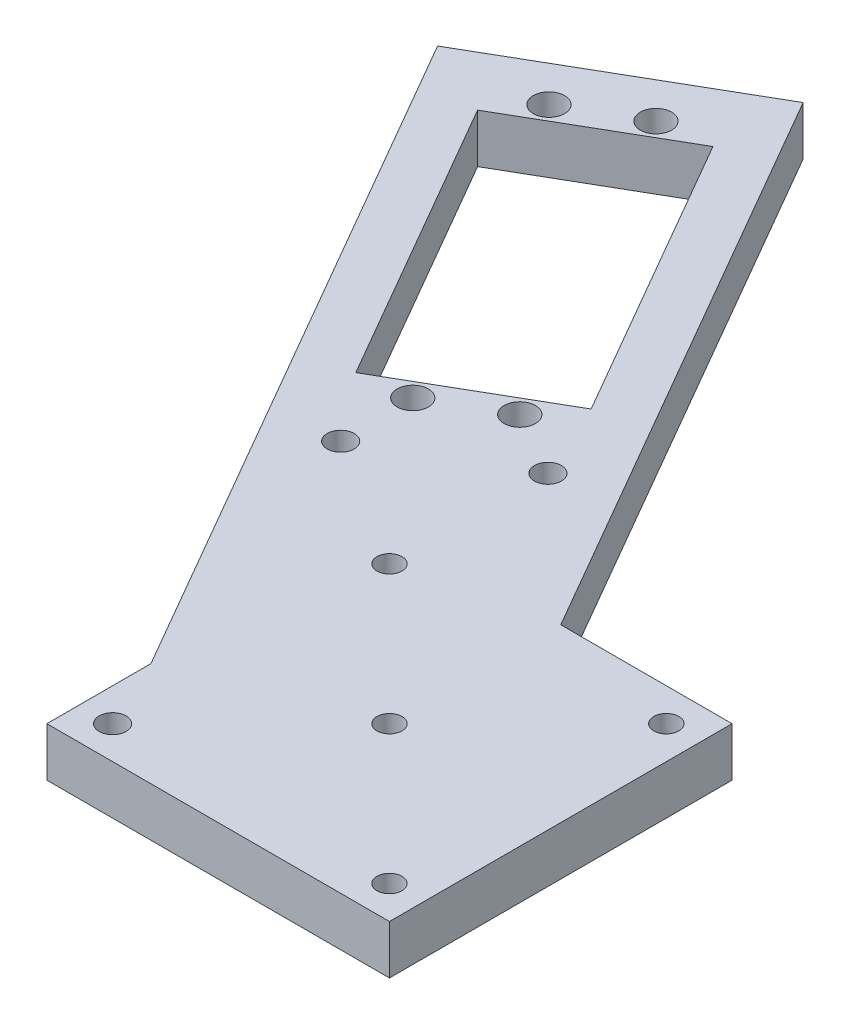
ISO-10303-21;
HEADER;
FILE_DESCRIPTION(('STEP AP214'),'2;1');
FILE_NAME('part.step','',(''),(''),'','','');
FILE_SCHEMA(('AUTOMOTIVE_DESIGN { 1 0 10303 214 1 1 1 1 }'));
ENDSEC;
DATA;
#1=APPLICATION_CONTEXT('core data for automotive mechanical design processes');
#2=APPLICATION_PROTOCOL_DEFINITION('international standard','automotive_design',2000,#1);
#3=PRODUCT_CONTEXT('',#1,'mechanical');
#4=PRODUCT('Part','Part','',(#3));
#5=PRODUCT_RELATED_PRODUCT_CATEGORY('part','',(#4));
#6=PRODUCT_DEFINITION_FORMATION('','',#4);
#7=PRODUCT_DEFINITION_CONTEXT('part definition',#1,'design');
#8=PRODUCT_DEFINITION('design','',#6,#7);
#9=PRODUCT_DEFINITION_SHAPE('','',#8);
#10=(LENGTH_UNIT() NAMED_UNIT(*) SI_UNIT(.MILLI.,.METRE.));
#11=(NAMED_UNIT(*) PLANE_ANGLE_UNIT() SI_UNIT($,.RADIAN.));
#12=(NAMED_UNIT(*) SI_UNIT($,.STERADIAN.) SOLID_ANGLE_UNIT());
#13=UNCERTAINTY_MEASURE_WITH_UNIT(LENGTH_MEASURE(1.E-05),#10,'distance_accuracy_value','');
#14=(GEOMETRIC_REPRESENTATION_CONTEXT(3) GLOBAL_UNCERTAINTY_ASSIGNED_CONTEXT((#13)) GLOBAL_UNIT_ASSIGNED_CONTEXT((#10,
#11,#12)) REPRESENTATION_CONTEXT('',''));
#15=CARTESIAN_POINT('',(0.,0.,0.));
#16=DIRECTION('',(0.,0.,1.));
#17=DIRECTION('',(1.,0.,0.));
#18=AXIS2_PLACEMENT_3D('',#15,#16,#17);
#19=CARTESIAN_POINT('',(0.,6.35,0.));
#20=DIRECTION('',(0.,1.,0.));
#21=DIRECTION('',(0.,0.,1.));
#22=AXIS2_PLACEMENT_3D('',#19,#20,#21);
#23=PLANE('',#22);
#24=CARTESIAN_POINT('',(-59.0837015967498,6.35,-80.0392716410195));
#25=DIRECTION('',(0.,-1.,0.));
#26=DIRECTION('',(0.,0.,-1.));
#27=AXIS2_PLACEMENT_3D('',#24,#25,#26);
#28=CIRCLE('',#27,2.032);
#29=CARTESIAN_POINT('',(-59.0837015967498,6.35,-82.0712716410195));
#30=VERTEX_POINT('',#29);
#31=EDGE_CURVE('E226',#30,#30,#28,.T.);
#32=ORIENTED_EDGE('',*,*,#31,.T.);
#33=EDGE_LOOP('',(#32));
#34=FACE_BOUND('',#33,.T.);
#35=CARTESIAN_POINT('',(-26.1548834943,6.35,-43.3248856543825));
#36=DIRECTION('',(0.,-1.,0.));
#37=DIRECTION('',(0.,0.,-1.));
#38=AXIS2_PLACEMENT_3D('',#35,#36,#37);
#39=CIRCLE('',#38,2.03200000000001);
#40=CARTESIAN_POINT('',(-26.1548834943,6.35,-45.3568856543825));
#41=VERTEX_POINT('',#40);
#42=EDGE_CURVE('E233',#41,#41,#39,.T.);
#43=ORIENTED_EDGE('',*,*,#42,.T.);
#44=EDGE_LOOP('',(#43));
#45=FACE_BOUND('',#44,.T.);
#46=CARTESIAN_POINT('',(-34.9537015967498,6.35,-38.2448856543825));
#47=DIRECTION('',(0.,-1.,0.));
#48=DIRECTION('',(0.,0.,-1.));
#49=AXIS2_PLACEMENT_3D('',#46,#47,#48);
#50=CIRCLE('',#49,2.03200000000001);
#51=CARTESIAN_POINT('',(-34.9537015967498,6.35,-40.2768856543825));
#52=VERTEX_POINT('',#51);
#53=EDGE_CURVE('E220',#52,#52,#50,.T.);
#54=ORIENTED_EDGE('',*,*,#53,.T.);
#55=EDGE_LOOP('',(#54));
#56=FACE_BOUND('',#55,.T.);
#57=CARTESIAN_POINT('',(-50.2848834942999,6.35,-85.1192716410195));
#58=DIRECTION('',(0.,-1.,0.));
#59=DIRECTION('',(0.,0.,-1.));
#60=AXIS2_PLACEMENT_3D('',#57,#58,#59);
#61=CIRCLE('',#60,2.032);
#62=CARTESIAN_POINT('',(-50.2848834942999,6.35,-87.1512716410195));
#63=VERTEX_POINT('',#62);
#64=EDGE_CURVE('E238',#63,#63,#61,.T.);
#65=ORIENTED_EDGE('',*,*,#64,.T.);
#66=EDGE_LOOP('',(#65));
#67=FACE_BOUND('',#66,.T.);
#68=DIRECTION('',(0.500000000000001,0.,0.866025403784438));
#69=VECTOR('',#68,1.);
#70=CARTESIAN_POINT('',(-20.2897420101024,6.35,11.7142880113207));
#71=LINE('',#70,#69);
#72=CARTESIAN_POINT('',(-72.8936886800531,6.35,-79.3984202996773));
#73=VERTEX_POINT('',#72);
#74=CARTESIAN_POINT('',(-22.093688680053,6.35,8.58976072482156));
#75=VERTEX_POINT('',#74);
#76=EDGE_CURVE('E244',#73,#75,#71,.T.);
#77=ORIENTED_EDGE('',*,*,#76,.T.);
#78=DIRECTION('',(0.,0.,1.));
#79=VECTOR('',#78,1.);
#80=CARTESIAN_POINT('',(-22.093688680053,6.35,0.));
#81=LINE('',#80,#79);
#82=CARTESIAN_POINT('',(-22.093688680053,6.35,22.0936886800531));
#83=VERTEX_POINT('',#82);
#84=EDGE_CURVE('E247',#75,#83,#81,.T.);
#85=ORIENTED_EDGE('',*,*,#84,.T.);
#86=DIRECTION('',(1.,0.,0.));
#87=VECTOR('',#86,1.);
#88=CARTESIAN_POINT('',(0.,6.35,22.0936886800531));
#89=LINE('',#88,#87);
#90=CARTESIAN_POINT('',(22.356311319947,6.35,22.0936886800531));
#91=VERTEX_POINT('',#90);
#92=EDGE_CURVE('E250',#83,#91,#89,.T.);
#93=ORIENTED_EDGE('',*,*,#92,.T.);
#94=DIRECTION('',(0.,0.,-1.));
#95=VECTOR('',#94,1.);
#96=CARTESIAN_POINT('',(22.356311319947,6.35,0.));
#97=LINE('',#96,#95);
#98=CARTESIAN_POINT('',(22.356311319947,6.35,-22.3563113199469));
#99=VERTEX_POINT('',#98);
#100=EDGE_CURVE('E252',#91,#99,#97,.T.);
#101=ORIENTED_EDGE('',*,*,#100,.T.);
#102=DIRECTION('',(-1.,0.,0.));
#103=VECTOR('',#102,1.);
#104=CARTESIAN_POINT('',(0.,6.35,-22.3563113199469));
#105=LINE('',#104,#103);
#106=CARTESIAN_POINT('',(0.131311319947031,6.35,-22.3563113199469));
#107=VERTEX_POINT('',#106);
#108=EDGE_CURVE('E254',#99,#107,#105,.T.);
#109=ORIENTED_EDGE('',*,*,#108,.T.);
#110=DIRECTION('',(0.500000000000001,0.,0.866025403784438));
#111=VECTOR('',#110,1.);
#112=CARTESIAN_POINT('',(9.77905025895412,6.35,-5.64593729942606));
#113=LINE('',#112,#111);
#114=CARTESIAN_POINT('',(-42.8248964109966,6.35,-96.758645610424));
#115=VERTEX_POINT('',#114);
#116=EDGE_CURVE('E256',#115,#107,#113,.T.);
#117=ORIENTED_EDGE('',*,*,#116,.F.);
#118=DIRECTION('',(-0.86602540378444,0.,0.499999999999998));
#119=VECTOR('',#118,1.);
#120=CARTESIAN_POINT('',(-52.6039466699504,6.35,-91.1127083109981));
#121=LINE('',#120,#119);
#122=EDGE_CURVE('E259',#115,#73,#121,.T.);
#123=ORIENTED_EDGE('',*,*,#122,.T.);
#124=EDGE_LOOP('',(#77,#85,#93,#101,#109,#117,#123));
#125=FACE_BOUND('',#124,.T.);
#126=CARTESIAN_POINT('',(-17.7237626625019,6.35,-38.5444330043896));
#127=DIRECTION('',(0.,1.,0.));
#128=DIRECTION('',(0.,0.,1.));
#129=AXIS2_PLACEMENT_3D('',#126,#127,#128);
#130=CIRCLE('',#129,1.74995000000001);
#131=CARTESIAN_POINT('',(-17.7237626625019,6.35,-36.7944830043896));
#132=VERTEX_POINT('',#131);
#133=EDGE_CURVE('E261',#132,#132,#130,.T.);
#134=ORIENTED_EDGE('',*,*,#133,.F.);
#135=EDGE_LOOP('',(#134));
#136=FACE_BOUND('',#135,.T.);
#137=CARTESIAN_POINT('',(-34.768288680053,6.35,-28.7037713199469));
#138=DIRECTION('',(0.,1.,0.));
#139=DIRECTION('',(0.,0.,1.));
#140=AXIS2_PLACEMENT_3D('',#137,#138,#139);
#141=CIRCLE('',#140,1.74995);
#142=CARTESIAN_POINT('',(-34.768288680053,6.35,-26.9538213199469));
#143=VERTEX_POINT('',#142);
#144=EDGE_CURVE('E264',#143,#143,#141,.T.);
#145=ORIENTED_EDGE('',*,*,#144,.F.);
#146=EDGE_LOOP('',(#145));
#147=FACE_BOUND('',#146,.T.);
#148=CARTESIAN_POINT('',(18.0918235620853,6.35,-18.0918235620852));
#149=DIRECTION('',(0.,1.,0.));
#150=DIRECTION('',(0.,0.,1.));
#151=AXIS2_PLACEMENT_3D('',#148,#149,#150);
#152=CIRCLE('',#151,1.62499999999988);
#153=CARTESIAN_POINT('',(18.0918235620853,6.35,-16.4668235620853));
#154=VERTEX_POINT('',#153);
#155=EDGE_CURVE('E267',#154,#154,#152,.T.);
#156=ORIENTED_EDGE('',*,*,#155,.F.);
#157=EDGE_LOOP('',(#156));
#158=FACE_BOUND('',#157,.T.);
#159=CARTESIAN_POINT('',(-17.8292009221912,6.35,17.8292009221914));
#160=DIRECTION('',(0.,1.,0.));
#161=DIRECTION('',(0.,0.,1.));
#162=AXIS2_PLACEMENT_3D('',#159,#160,#161);
#163=CIRCLE('',#162,1.75);
#164=CARTESIAN_POINT('',(-17.8292009221912,6.35,19.5792009221914));
#165=VERTEX_POINT('',#164);
#166=EDGE_CURVE('E270',#165,#165,#163,.T.);
#167=ORIENTED_EDGE('',*,*,#166,.F.);
#168=EDGE_LOOP('',(#167));
#169=FACE_BOUND('',#168,.T.);
#170=CARTESIAN_POINT('',(18.0918235620853,6.35,17.8292009221915));
#171=DIRECTION('',(0.,1.,0.));
#172=DIRECTION('',(0.,0.,1.));
#173=AXIS2_PLACEMENT_3D('',#170,#171,#172);
#174=CIRCLE('',#173,1.62500000000009);
#175=CARTESIAN_POINT('',(18.0918235620853,6.35,19.4542009221916));
#176=VERTEX_POINT('',#175);
#177=EDGE_CURVE('E273',#176,#176,#174,.T.);
#178=ORIENTED_EDGE('',*,*,#177,.F.);
#179=EDGE_LOOP('',(#178));
#180=FACE_BOUND('',#179,.T.);
#181=CARTESIAN_POINT('',(0.131311319947036,6.35,-0.131311319946925));
#182=DIRECTION('',(0.,1.,0.));
#183=DIRECTION('',(0.,0.,1.));
#184=AXIS2_PLACEMENT_3D('',#181,#182,#183);
#185=CIRCLE('',#184,1.62500000000009);
#186=CARTESIAN_POINT('',(0.131311319947036,6.35,1.49368868005317));
#187=VERTEX_POINT('',#186);
#188=EDGE_CURVE('E276',#187,#187,#185,.T.);
#189=ORIENTED_EDGE('',*,*,#188,.F.);
#190=EDGE_LOOP('',(#189));
#191=FACE_BOUND('',#190,.T.);
#192=CARTESIAN_POINT('',(-17.8292009221912,6.35,-18.0918235620852));
#193=DIRECTION('',(0.,1.,0.));
#194=DIRECTION('',(0.,0.,1.));
#195=AXIS2_PLACEMENT_3D('',#192,#193,#194);
#196=CIRCLE('',#195,1.62500000000009);
#197=CARTESIAN_POINT('',(-17.8292009221912,6.35,-16.4668235620851));
#198=VERTEX_POINT('',#197);
#199=EDGE_CURVE('E279',#198,#198,#196,.T.);
#200=ORIENTED_EDGE('',*,*,#199,.F.);
#201=EDGE_LOOP('',(#200));
#202=FACE_BOUND('',#201,.T.);
#203=DIRECTION('',(0.866025403784439,0.,-0.5));
#204=VECTOR('',#203,1.);
#205=CARTESIAN_POINT('',(-48.1589466699505,6.35,-83.4137424713545));
#206=LINE('',#205,#204);
#207=CARTESIAN_POINT('',(-63.0929924582198,6.35,-74.791567115407));
#208=VERTEX_POINT('',#207);
#209=CARTESIAN_POINT('',(-43.73559263283,6.35,-85.967567115407));
#210=VERTEX_POINT('',#209);
#211=EDGE_CURVE('E197',#208,#210,#206,.T.);
#212=ORIENTED_EDGE('',*,*,#211,.T.);
#213=DIRECTION('',(-0.5,0.,-0.866025403784439));
#214=VECTOR('',#213,1.);
#215=CARTESIAN_POINT('',(4.42335403712058,6.35,-2.55382464405258));
#216=LINE('',#215,#214);
#217=CARTESIAN_POINT('',(-22.14559263283,6.35,-48.572590179995));
#218=VERTEX_POINT('',#217);
#219=EDGE_CURVE('E193',#218,#210,#216,.T.);
#220=ORIENTED_EDGE('',*,*,#219,.F.);
#221=DIRECTION('',(0.866025403784439,0.,-0.5));
#222=VECTOR('',#221,1.);
#223=CARTESIAN_POINT('',(-26.5689466699506,6.35,-46.0187655359424));
#224=LINE('',#223,#222);
#225=CARTESIAN_POINT('',(-41.5029924582198,6.35,-37.396590179995));
#226=VERTEX_POINT('',#225);
#227=EDGE_CURVE('E185',#226,#218,#224,.T.);
#228=ORIENTED_EDGE('',*,*,#227,.F.);
#229=DIRECTION('',(-0.5,0.,-0.866025403784439));
#230=VECTOR('',#229,1.);
#231=CARTESIAN_POINT('',(-14.9340457882692,6.35,8.62217535594742));
#232=LINE('',#231,#230);
#233=EDGE_CURVE('E117',#226,#208,#232,.T.);
#234=ORIENTED_EDGE('',*,*,#233,.T.);
#235=EDGE_LOOP('',(#212,#220,#228,#234));
#236=FACE_BOUND('',#235,.T.);
#237=ADVANCED_FACE('F102',(#34,#45,#56,#67,#125,#136,#147,#158,#169,#180,#191,#202,#236),#23,.T.);
#238=CARTESIAN_POINT('',(0.,0.,0.));
#239=DIRECTION('',(0.,1.,0.));
#240=DIRECTION('',(0.,0.,1.));
#241=AXIS2_PLACEMENT_3D('',#238,#239,#240);
#242=PLANE('',#241);
#243=CARTESIAN_POINT('',(-59.0837015967498,0.,-80.0392716410195));
#244=DIRECTION('',(0.,-1.,0.));
#245=DIRECTION('',(0.,0.,-1.));
#246=AXIS2_PLACEMENT_3D('',#243,#244,#245);
#247=CIRCLE('',#246,2.032);
#248=CARTESIAN_POINT('',(-59.0837015967498,0.,-82.0712716410195));
#249=VERTEX_POINT('',#248);
#250=EDGE_CURVE('E230',#249,#249,#247,.T.);
#251=ORIENTED_EDGE('',*,*,#250,.F.);
#252=EDGE_LOOP('',(#251));
#253=FACE_BOUND('',#252,.T.);
#254=CARTESIAN_POINT('',(-26.1548834943,0.,-43.3248856543825));
#255=DIRECTION('',(0.,-1.,0.));
#256=DIRECTION('',(0.,0.,-1.));
#257=AXIS2_PLACEMENT_3D('',#254,#255,#256);
#258=CIRCLE('',#257,2.03200000000001);
#259=CARTESIAN_POINT('',(-26.1548834943,0.,-45.3568856543825));
#260=VERTEX_POINT('',#259);
#261=EDGE_CURVE('E223',#260,#260,#258,.T.);
#262=ORIENTED_EDGE('',*,*,#261,.F.);
#263=EDGE_LOOP('',(#262));
#264=FACE_BOUND('',#263,.T.);
#265=CARTESIAN_POINT('',(-17.8292009221912,0.,-18.0918235620852));
#266=DIRECTION('',(0.,1.,0.));
#267=DIRECTION('',(0.,0.,1.));
#268=AXIS2_PLACEMENT_3D('',#265,#266,#267);
#269=CIRCLE('',#268,1.62500000000009);
#270=CARTESIAN_POINT('',(-17.8292009221912,0.,-16.4668235620851));
#271=VERTEX_POINT('',#270);
#272=EDGE_CURVE('E248',#271,#271,#269,.T.);
#273=ORIENTED_EDGE('',*,*,#272,.T.);
#274=EDGE_LOOP('',(#273));
#275=FACE_BOUND('',#274,.T.);
#276=CARTESIAN_POINT('',(0.131311319947036,0.,-0.131311319946925));
#277=DIRECTION('',(0.,1.,0.));
#278=DIRECTION('',(0.,0.,1.));
#279=AXIS2_PLACEMENT_3D('',#276,#277,#278);
#280=CIRCLE('',#279,1.62500000000009);
#281=CARTESIAN_POINT('',(0.131311319947036,0.,1.49368868005317));
#282=VERTEX_POINT('',#281);
#283=EDGE_CURVE('E314',#282,#282,#280,.T.);
#284=ORIENTED_EDGE('',*,*,#283,.T.);
#285=EDGE_LOOP('',(#284));
#286=FACE_BOUND('',#285,.T.);
#287=CARTESIAN_POINT('',(18.0918235620853,0.,17.8292009221915));
#288=DIRECTION('',(0.,1.,0.));
#289=DIRECTION('',(0.,0.,1.));
#290=AXIS2_PLACEMENT_3D('',#287,#288,#289);
#291=CIRCLE('',#290,1.62500000000009);
#292=CARTESIAN_POINT('',(18.0918235620853,0.,19.4542009221916));
#293=VERTEX_POINT('',#292);
#294=EDGE_CURVE('E311',#293,#293,#291,.T.);
#295=ORIENTED_EDGE('',*,*,#294,.T.);
#296=EDGE_LOOP('',(#295));
#297=FACE_BOUND('',#296,.T.);
#298=CARTESIAN_POINT('',(-17.8292009221912,0.,17.8292009221914));
#299=DIRECTION('',(0.,1.,0.));
#300=DIRECTION('',(0.,0.,1.));
#301=AXIS2_PLACEMENT_3D('',#298,#299,#300);
#302=CIRCLE('',#301,1.75);
#303=CARTESIAN_POINT('',(-17.8292009221912,0.,19.5792009221914));
#304=VERTEX_POINT('',#303);
#305=EDGE_CURVE('E308',#304,#304,#302,.T.);
#306=ORIENTED_EDGE('',*,*,#305,.T.);
#307=EDGE_LOOP('',(#306));
#308=FACE_BOUND('',#307,.T.);
#309=CARTESIAN_POINT('',(18.0918235620853,0.,-18.0918235620852));
#310=DIRECTION('',(0.,1.,0.));
#311=DIRECTION('',(0.,0.,1.));
#312=AXIS2_PLACEMENT_3D('',#309,#310,#311);
#313=CIRCLE('',#312,1.62499999999988);
#314=CARTESIAN_POINT('',(18.0918235620853,0.,-16.4668235620853));
#315=VERTEX_POINT('',#314);
#316=EDGE_CURVE('E305',#315,#315,#313,.T.);
#317=ORIENTED_EDGE('',*,*,#316,.T.);
#318=EDGE_LOOP('',(#317));
#319=FACE_BOUND('',#318,.T.);
#320=CARTESIAN_POINT('',(-34.768288680053,0.,-28.7037713199469));
#321=DIRECTION('',(0.,1.,0.));
#322=DIRECTION('',(0.,0.,1.));
#323=AXIS2_PLACEMENT_3D('',#320,#321,#322);
#324=CIRCLE('',#323,1.74995);
#325=CARTESIAN_POINT('',(-34.768288680053,0.,-26.9538213199469));
#326=VERTEX_POINT('',#325);
#327=EDGE_CURVE('E302',#326,#326,#324,.T.);
#328=ORIENTED_EDGE('',*,*,#327,.T.);
#329=EDGE_LOOP('',(#328));
#330=FACE_BOUND('',#329,.T.);
#331=CARTESIAN_POINT('',(-17.7237626625019,0.,-38.5444330043896));
#332=DIRECTION('',(0.,1.,0.));
#333=DIRECTION('',(0.,0.,1.));
#334=AXIS2_PLACEMENT_3D('',#331,#332,#333);
#335=CIRCLE('',#334,1.74995000000001);
#336=CARTESIAN_POINT('',(-17.7237626625019,0.,-36.7944830043896));
#337=VERTEX_POINT('',#336);
#338=EDGE_CURVE('E299',#337,#337,#335,.T.);
#339=ORIENTED_EDGE('',*,*,#338,.T.);
#340=EDGE_LOOP('',(#339));
#341=FACE_BOUND('',#340,.T.);
#342=DIRECTION('',(0.500000000000001,0.,0.866025403784438));
#343=VECTOR('',#342,1.);
#344=CARTESIAN_POINT('',(-20.2897420101024,0.,11.7142880113207));
#345=LINE('',#344,#343);
#346=CARTESIAN_POINT('',(-72.8936886800531,0.,-79.3984202996773));
#347=VERTEX_POINT('',#346);
#348=CARTESIAN_POINT('',(-22.093688680053,0.,8.58976072482156));
#349=VERTEX_POINT('',#348);
#350=EDGE_CURVE('E241',#347,#349,#345,.T.);
#351=ORIENTED_EDGE('',*,*,#350,.F.);
#352=DIRECTION('',(-0.86602540378444,0.,0.499999999999998));
#353=VECTOR('',#352,1.);
#354=CARTESIAN_POINT('',(-52.6039466699504,0.,-91.1127083109981));
#355=LINE('',#354,#353);
#356=CARTESIAN_POINT('',(-42.8248964109966,0.,-96.758645610424));
#357=VERTEX_POINT('',#356);
#358=EDGE_CURVE('E297',#357,#347,#355,.T.);
#359=ORIENTED_EDGE('',*,*,#358,.F.);
#360=DIRECTION('',(0.500000000000001,0.,0.866025403784438));
#361=VECTOR('',#360,1.);
#362=CARTESIAN_POINT('',(9.77905025895412,0.,-5.64593729942606));
#363=LINE('',#362,#361);
#364=CARTESIAN_POINT('',(0.131311319947031,0.,-22.3563113199469));
#365=VERTEX_POINT('',#364);
#366=EDGE_CURVE('E294',#357,#365,#363,.T.);
#367=ORIENTED_EDGE('',*,*,#366,.T.);
#368=DIRECTION('',(-1.,0.,0.));
#369=VECTOR('',#368,1.);
#370=CARTESIAN_POINT('',(0.,0.,-22.3563113199469));
#371=LINE('',#370,#369);
#372=CARTESIAN_POINT('',(22.356311319947,0.,-22.3563113199469));
#373=VERTEX_POINT('',#372);
#374=EDGE_CURVE('E291',#373,#365,#371,.T.);
#375=ORIENTED_EDGE('',*,*,#374,.F.);
#376=DIRECTION('',(0.,0.,-1.));
#377=VECTOR('',#376,1.);
#378=CARTESIAN_POINT('',(22.356311319947,0.,0.));
#379=LINE('',#378,#377);
#380=CARTESIAN_POINT('',(22.356311319947,0.,22.0936886800531));
#381=VERTEX_POINT('',#380);
#382=EDGE_CURVE('E289',#381,#373,#379,.T.);
#383=ORIENTED_EDGE('',*,*,#382,.F.);
#384=DIRECTION('',(1.,0.,0.));
#385=VECTOR('',#384,1.);
#386=CARTESIAN_POINT('',(0.,0.,22.0936886800531));
#387=LINE('',#386,#385);
#388=CARTESIAN_POINT('',(-22.093688680053,0.,22.0936886800531));
#389=VERTEX_POINT('',#388);
#390=EDGE_CURVE('E287',#389,#381,#387,.T.);
#391=ORIENTED_EDGE('',*,*,#390,.F.);
#392=DIRECTION('',(0.,0.,1.));
#393=VECTOR('',#392,1.);
#394=CARTESIAN_POINT('',(-22.093688680053,0.,0.));
#395=LINE('',#394,#393);
#396=EDGE_CURVE('E285',#349,#389,#395,.T.);
#397=ORIENTED_EDGE('',*,*,#396,.F.);
#398=EDGE_LOOP('',(#351,#359,#367,#375,#383,#391,#397));
#399=FACE_BOUND('',#398,.T.);
#400=CARTESIAN_POINT('',(-50.2848834942999,0.,-85.1192716410195));
#401=DIRECTION('',(0.,-1.,0.));
#402=DIRECTION('',(0.,0.,-1.));
#403=AXIS2_PLACEMENT_3D('',#400,#401,#402);
#404=CIRCLE('',#403,2.032);
#405=CARTESIAN_POINT('',(-50.2848834942999,0.,-87.1512716410195));
#406=VERTEX_POINT('',#405);
#407=EDGE_CURVE('E229',#406,#406,#404,.T.);
#408=ORIENTED_EDGE('',*,*,#407,.F.);
#409=EDGE_LOOP('',(#408));
#410=FACE_BOUND('',#409,.T.);
#411=CARTESIAN_POINT('',(-34.9537015967498,0.,-38.2448856543825));
#412=DIRECTION('',(0.,-1.,0.));
#413=DIRECTION('',(0.,0.,-1.));
#414=AXIS2_PLACEMENT_3D('',#411,#412,#413);
#415=CIRCLE('',#414,2.03200000000001);
#416=CARTESIAN_POINT('',(-34.9537015967498,0.,-40.2768856543825));
#417=VERTEX_POINT('',#416);
#418=EDGE_CURVE('E216',#417,#417,#415,.T.);
#419=ORIENTED_EDGE('',*,*,#418,.F.);
#420=EDGE_LOOP('',(#419));
#421=FACE_BOUND('',#420,.T.);
#422=DIRECTION('',(-0.5,0.,-0.866025403784439));
#423=VECTOR('',#422,1.);
#424=CARTESIAN_POINT('',(4.42335403712058,0.,-2.55382464405258));
#425=LINE('',#424,#423);
#426=CARTESIAN_POINT('',(-22.14559263283,0.,-48.572590179995));
#427=VERTEX_POINT('',#426);
#428=CARTESIAN_POINT('',(-43.73559263283,0.,-85.967567115407));
#429=VERTEX_POINT('',#428);
#430=EDGE_CURVE('E125',#427,#429,#425,.T.);
#431=ORIENTED_EDGE('',*,*,#430,.T.);
#432=DIRECTION('',(0.866025403784439,0.,-0.5));
#433=VECTOR('',#432,1.);
#434=CARTESIAN_POINT('',(-48.1589466699505,0.,-83.4137424713545));
#435=LINE('',#434,#433);
#436=CARTESIAN_POINT('',(-63.0929924582198,0.,-74.791567115407));
#437=VERTEX_POINT('',#436);
#438=EDGE_CURVE('E201',#437,#429,#435,.T.);
#439=ORIENTED_EDGE('',*,*,#438,.F.);
#440=DIRECTION('',(-0.5,0.,-0.866025403784439));
#441=VECTOR('',#440,1.);
#442=CARTESIAN_POINT('',(-14.9340457882692,0.,8.62217535594742));
#443=LINE('',#442,#441);
#444=CARTESIAN_POINT('',(-41.5029924582198,0.,-37.396590179995));
#445=VERTEX_POINT('',#444);
#446=EDGE_CURVE('E204',#445,#437,#443,.T.);
#447=ORIENTED_EDGE('',*,*,#446,.F.);
#448=DIRECTION('',(0.866025403784439,0.,-0.5));
#449=VECTOR('',#448,1.);
#450=CARTESIAN_POINT('',(-26.5689466699506,0.,-46.0187655359424));
#451=LINE('',#450,#449);
#452=EDGE_CURVE('E210',#445,#427,#451,.T.);
#453=ORIENTED_EDGE('',*,*,#452,.T.);
#454=EDGE_LOOP('',(#431,#439,#447,#453));
#455=FACE_BOUND('',#454,.T.);
#456=ADVANCED_FACE('F341',(#253,#264,#275,#286,#297,#308,#319,#330,#341,#399,#410,#421,#455),
#242,.F.);
#457=CARTESIAN_POINT('',(-20.2897420101024,6.35,11.7142880113207));
#458=DIRECTION('',(0.866025403784438,0.,-0.500000000000001));
#459=DIRECTION('',(-0.500000000000001,0.,-0.866025403784438));
#460=AXIS2_PLACEMENT_3D('',#457,#458,#459);
#461=PLANE('',#460);
#462=ORIENTED_EDGE('',*,*,#350,.T.);
#463=DIRECTION('',(0.,-1.,0.));
#464=VECTOR('',#463,1.);
#465=CARTESIAN_POINT('',(-22.093688680053,6.35,8.58976072482156));
#466=LINE('',#465,#464);
#467=EDGE_CURVE('E12',#75,#349,#466,.T.);
#468=ORIENTED_EDGE('',*,*,#467,.F.);
#469=ORIENTED_EDGE('',*,*,#76,.F.);
#470=DIRECTION('',(0.,-1.,0.));
#471=VECTOR('',#470,1.);
#472=CARTESIAN_POINT('',(-72.8936886800531,6.35,-79.3984202996773));
#473=LINE('',#472,#471);
#474=EDGE_CURVE('E282',#73,#347,#473,.T.);
#475=ORIENTED_EDGE('',*,*,#474,.T.);
#476=EDGE_LOOP('',(#462,#468,#469,#475));
#477=FACE_BOUND('',#476,.T.);
#478=ADVANCED_FACE('F104',(#477),#461,.F.);
#479=CARTESIAN_POINT('',(-22.093688680053,6.35,0.));
#480=DIRECTION('',(1.,0.,0.));
#481=DIRECTION('',(0.,0.,-1.));
#482=AXIS2_PLACEMENT_3D('',#479,#480,#481);
#483=PLANE('',#482);
#484=ORIENTED_EDGE('',*,*,#396,.T.);
#485=DIRECTION('',(0.,-1.,0.));
#486=VECTOR('',#485,1.);
#487=CARTESIAN_POINT('',(-22.093688680053,6.35,22.0936886800531));
#488=LINE('',#487,#486);
#489=EDGE_CURVE('E110',#83,#389,#488,.T.);
#490=ORIENTED_EDGE('',*,*,#489,.F.);
#491=ORIENTED_EDGE('',*,*,#84,.F.);
#492=ORIENTED_EDGE('',*,*,#467,.T.);
#493=EDGE_LOOP('',(#484,#490,#491,#492));
#494=FACE_BOUND('',#493,.T.);
#495=ADVANCED_FACE('F357',(#494),#483,.F.);
#496=CARTESIAN_POINT('',(0.,6.35,22.0936886800531));
#497=DIRECTION('',(0.,0.,-1.));
#498=DIRECTION('',(-1.,0.,0.));
#499=AXIS2_PLACEMENT_3D('',#496,#497,#498);
#500=PLANE('',#499);
#501=ORIENTED_EDGE('',*,*,#390,.T.);
#502=DIRECTION('',(0.,-1.,0.));
#503=VECTOR('',#502,1.);
#504=CARTESIAN_POINT('',(22.356311319947,6.35,22.0936886800531));
#505=LINE('',#504,#503);
#506=EDGE_CURVE('E328',#91,#381,#505,.T.);
#507=ORIENTED_EDGE('',*,*,#506,.F.);
#508=ORIENTED_EDGE('',*,*,#92,.F.);
#509=ORIENTED_EDGE('',*,*,#489,.T.);
#510=EDGE_LOOP('',(#501,#507,#508,#509));
#511=FACE_BOUND('',#510,.T.);
#512=ADVANCED_FACE('F335',(#511),#500,.F.);
#513=CARTESIAN_POINT('',(22.356311319947,6.35,0.));
#514=DIRECTION('',(-1.,0.,0.));
#515=DIRECTION('',(0.,0.,1.));
#516=AXIS2_PLACEMENT_3D('',#513,#514,#515);
#517=PLANE('',#516);
#518=ORIENTED_EDGE('',*,*,#382,.T.);
#519=DIRECTION('',(0.,-1.,0.));
#520=VECTOR('',#519,1.);
#521=CARTESIAN_POINT('',(22.356311319947,6.35,-22.3563113199469));
#522=LINE('',#521,#520);
#523=EDGE_CURVE('E325',#99,#373,#522,.T.);
#524=ORIENTED_EDGE('',*,*,#523,.F.);
#525=ORIENTED_EDGE('',*,*,#100,.F.);
#526=ORIENTED_EDGE('',*,*,#506,.T.);
#527=EDGE_LOOP('',(#518,#524,#525,#526));
#528=FACE_BOUND('',#527,.T.);
#529=ADVANCED_FACE('F346',(#528),#517,.F.);
#530=CARTESIAN_POINT('',(0.,6.35,-22.3563113199469));
#531=DIRECTION('',(0.,0.,1.));
#532=DIRECTION('',(1.,0.,0.));
#533=AXIS2_PLACEMENT_3D('',#530,#531,#532);
#534=PLANE('',#533);
#535=ORIENTED_EDGE('',*,*,#374,.T.);
#536=DIRECTION('',(0.,-1.,0.));
#537=VECTOR('',#536,1.);
#538=CARTESIAN_POINT('',(0.131311319947031,6.35,-22.3563113199469));
#539=LINE('',#538,#537);
#540=EDGE_CURVE('E323',#107,#365,#539,.T.);
#541=ORIENTED_EDGE('',*,*,#540,.F.);
#542=ORIENTED_EDGE('',*,*,#108,.F.);
#543=ORIENTED_EDGE('',*,*,#523,.T.);
#544=EDGE_LOOP('',(#535,#541,#542,#543));
#545=FACE_BOUND('',#544,.T.);
#546=ADVANCED_FACE('F350',(#545),#534,.F.);
#547=CARTESIAN_POINT('',(9.77905025895412,6.35,-5.64593729942606));
#548=DIRECTION('',(0.866025403784438,0.,-0.500000000000001));
#549=DIRECTION('',(-0.500000000000001,0.,-0.866025403784438));
#550=AXIS2_PLACEMENT_3D('',#547,#548,#549);
#551=PLANE('',#550);
#552=ORIENTED_EDGE('',*,*,#366,.F.);
#553=DIRECTION('',(0.,-1.,0.));
#554=VECTOR('',#553,1.);
#555=CARTESIAN_POINT('',(-42.8248964109966,6.35,-96.758645610424));
#556=LINE('',#555,#554);
#557=EDGE_CURVE('E321',#115,#357,#556,.T.);
#558=ORIENTED_EDGE('',*,*,#557,.F.);
#559=ORIENTED_EDGE('',*,*,#116,.T.);
#560=ORIENTED_EDGE('',*,*,#540,.T.);
#561=EDGE_LOOP('',(#552,#558,#559,#560));
#562=FACE_BOUND('',#561,.T.);
#563=ADVANCED_FACE('F364',(#562),#551,.T.);
#564=CARTESIAN_POINT('',(0.131311319947036,6.35,-0.131311319946925));
#565=DIRECTION('',(0.,-1.,0.));
#566=DIRECTION('',(0.,0.,-1.));
#567=AXIS2_PLACEMENT_3D('',#564,#565,#566);
#568=CYLINDRICAL_SURFACE('',#567,1.62500000000009);
#569=ORIENTED_EDGE('',*,*,#188,.T.);
#570=EDGE_LOOP('',(#569));
#571=FACE_BOUND('',#570,.T.);
#572=ORIENTED_EDGE('',*,*,#283,.F.);
#573=EDGE_LOOP('',(#572));
#574=FACE_BOUND('',#573,.T.);
#575=ADVANCED_FACE('F394',(#571,#574),#568,.F.);
#576=CARTESIAN_POINT('',(18.0918235620853,6.35,17.8292009221915));
#577=DIRECTION('',(0.,-1.,0.));
#578=DIRECTION('',(0.,0.,-1.));
#579=AXIS2_PLACEMENT_3D('',#576,#577,#578);
#580=CYLINDRICAL_SURFACE('',#579,1.62500000000009);
#581=ORIENTED_EDGE('',*,*,#177,.T.);
#582=EDGE_LOOP('',(#581));
#583=FACE_BOUND('',#582,.T.);
#584=ORIENTED_EDGE('',*,*,#294,.F.);
#585=EDGE_LOOP('',(#584));
#586=FACE_BOUND('',#585,.T.);
#587=ADVANCED_FACE('F397',(#583,#586),#580,.F.);
#588=CARTESIAN_POINT('',(-17.8292009221912,6.35,17.8292009221914));
#589=DIRECTION('',(0.,-1.,0.));
#590=DIRECTION('',(0.,0.,-1.));
#591=AXIS2_PLACEMENT_3D('',#588,#589,#590);
#592=CYLINDRICAL_SURFACE('',#591,1.75);
#593=ORIENTED_EDGE('',*,*,#166,.T.);
#594=EDGE_LOOP('',(#593));
#595=FACE_BOUND('',#594,.T.);
#596=ORIENTED_EDGE('',*,*,#305,.F.);
#597=EDGE_LOOP('',(#596));
#598=FACE_BOUND('',#597,.T.);
#599=ADVANCED_FACE('F401',(#595,#598),#592,.F.);
#600=CARTESIAN_POINT('',(18.0918235620853,6.35,-18.0918235620852));
#601=DIRECTION('',(0.,-1.,0.));
#602=DIRECTION('',(0.,0.,-1.));
#603=AXIS2_PLACEMENT_3D('',#600,#601,#602);
#604=CYLINDRICAL_SURFACE('',#603,1.62499999999988);
#605=ORIENTED_EDGE('',*,*,#155,.T.);
#606=EDGE_LOOP('',(#605));
#607=FACE_BOUND('',#606,.T.);
#608=ORIENTED_EDGE('',*,*,#316,.F.);
#609=EDGE_LOOP('',(#608));
#610=FACE_BOUND('',#609,.T.);
#611=ADVANCED_FACE('F405',(#607,#610),#604,.F.);
#612=CARTESIAN_POINT('',(-34.768288680053,6.35,-28.7037713199469));
#613=DIRECTION('',(0.,-1.,0.));
#614=DIRECTION('',(0.,0.,-1.));
#615=AXIS2_PLACEMENT_3D('',#612,#613,#614);
#616=CYLINDRICAL_SURFACE('',#615,1.74995);
#617=ORIENTED_EDGE('',*,*,#144,.T.);
#618=EDGE_LOOP('',(#617));
#619=FACE_BOUND('',#618,.T.);
#620=ORIENTED_EDGE('',*,*,#327,.F.);
#621=EDGE_LOOP('',(#620));
#622=FACE_BOUND('',#621,.T.);
#623=ADVANCED_FACE('F378',(#619,#622),#616,.F.);
#624=CARTESIAN_POINT('',(-17.7237626625019,6.35,-38.5444330043896));
#625=DIRECTION('',(0.,-1.,0.));
#626=DIRECTION('',(0.,0.,-1.));
#627=AXIS2_PLACEMENT_3D('',#624,#625,#626);
#628=CYLINDRICAL_SURFACE('',#627,1.74995000000001);
#629=ORIENTED_EDGE('',*,*,#133,.T.);
#630=EDGE_LOOP('',(#629));
#631=FACE_BOUND('',#630,.T.);
#632=ORIENTED_EDGE('',*,*,#338,.F.);
#633=EDGE_LOOP('',(#632));
#634=FACE_BOUND('',#633,.T.);
#635=ADVANCED_FACE('F369',(#631,#634),#628,.F.);
#636=CARTESIAN_POINT('',(-52.6039466699504,6.35,-91.1127083109981));
#637=DIRECTION('',(0.499999999999998,0.,0.86602540378444));
#638=DIRECTION('',(0.86602540378444,0.,-0.499999999999998));
#639=AXIS2_PLACEMENT_3D('',#636,#637,#638);
#640=PLANE('',#639);
#641=ORIENTED_EDGE('',*,*,#358,.T.);
#642=ORIENTED_EDGE('',*,*,#474,.F.);
#643=ORIENTED_EDGE('',*,*,#122,.F.);
#644=ORIENTED_EDGE('',*,*,#557,.T.);
#645=EDGE_LOOP('',(#641,#642,#643,#644));
#646=FACE_BOUND('',#645,.T.);
#647=ADVANCED_FACE('F366',(#646),#640,.F.);
#648=CARTESIAN_POINT('',(-17.8292009221912,6.35,-18.0918235620852));
#649=DIRECTION('',(0.,-1.,0.));
#650=DIRECTION('',(0.,0.,-1.));
#651=AXIS2_PLACEMENT_3D('',#648,#649,#650);
#652=CYLINDRICAL_SURFACE('',#651,1.62500000000009);
#653=ORIENTED_EDGE('',*,*,#199,.T.);
#654=EDGE_LOOP('',(#653));
#655=FACE_BOUND('',#654,.T.);
#656=ORIENTED_EDGE('',*,*,#272,.F.);
#657=EDGE_LOOP('',(#656));
#658=FACE_BOUND('',#657,.T.);
#659=ADVANCED_FACE('F368',(#655,#658),#652,.F.);
#660=CARTESIAN_POINT('',(-50.2848834942999,6.35,-85.1192716410195));
#661=DIRECTION('',(0.,-1.,0.));
#662=DIRECTION('',(0.,0.,-1.));
#663=AXIS2_PLACEMENT_3D('',#660,#661,#662);
#664=CYLINDRICAL_SURFACE('',#663,2.032);
#665=ORIENTED_EDGE('',*,*,#64,.F.);
#666=EDGE_LOOP('',(#665));
#667=FACE_BOUND('',#666,.T.);
#668=ORIENTED_EDGE('',*,*,#407,.T.);
#669=EDGE_LOOP('',(#668));
#670=FACE_BOUND('',#669,.T.);
#671=ADVANCED_FACE('F375',(#667,#670),#664,.F.);
#672=CARTESIAN_POINT('',(-34.9537015967498,6.35,-38.2448856543825));
#673=DIRECTION('',(0.,-1.,0.));
#674=DIRECTION('',(0.,0.,-1.));
#675=AXIS2_PLACEMENT_3D('',#672,#673,#674);
#676=CYLINDRICAL_SURFACE('',#675,2.03200000000001);
#677=ORIENTED_EDGE('',*,*,#53,.F.);
#678=EDGE_LOOP('',(#677));
#679=FACE_BOUND('',#678,.T.);
#680=ORIENTED_EDGE('',*,*,#418,.T.);
#681=EDGE_LOOP('',(#680));
#682=FACE_BOUND('',#681,.T.);
#683=ADVANCED_FACE('F495',(#679,#682),#676,.F.);
#684=CARTESIAN_POINT('',(4.42335403712058,6.35,-2.55382464405258));
#685=DIRECTION('',(-0.866025403784439,0.,0.5));
#686=DIRECTION('',(0.5,0.,0.866025403784439));
#687=AXIS2_PLACEMENT_3D('',#684,#685,#686);
#688=PLANE('',#687);
#689=ORIENTED_EDGE('',*,*,#430,.F.);
#690=DIRECTION('',(0.,-1.,0.));
#691=VECTOR('',#690,1.);
#692=CARTESIAN_POINT('',(-22.14559263283,6.35,-48.572590179995));
#693=LINE('',#692,#691);
#694=EDGE_CURVE('E188',#218,#427,#693,.T.);
#695=ORIENTED_EDGE('',*,*,#694,.F.);
#696=ORIENTED_EDGE('',*,*,#219,.T.);
#697=DIRECTION('',(0.,-1.,0.));
#698=VECTOR('',#697,1.);
#699=CARTESIAN_POINT('',(-43.73559263283,6.35,-85.967567115407));
#700=LINE('',#699,#698);
#701=EDGE_CURVE('E214',#210,#429,#700,.T.);
#702=ORIENTED_EDGE('',*,*,#701,.T.);
#703=EDGE_LOOP('',(#689,#695,#696,#702));
#704=FACE_BOUND('',#703,.T.);
#705=ADVANCED_FACE('F195',(#704),#688,.T.);
#706=CARTESIAN_POINT('',(-48.1589466699505,6.35,-83.4137424713545));
#707=DIRECTION('',(-0.499999999999999,0.,-0.866025403784439));
#708=DIRECTION('',(-0.866025403784439,0.,0.5));
#709=AXIS2_PLACEMENT_3D('',#706,#707,#708);
#710=PLANE('',#709);
#711=ORIENTED_EDGE('',*,*,#438,.T.);
#712=ORIENTED_EDGE('',*,*,#701,.F.);
#713=ORIENTED_EDGE('',*,*,#211,.F.);
#714=DIRECTION('',(0.,-1.,0.));
#715=VECTOR('',#714,1.);
#716=CARTESIAN_POINT('',(-63.0929924582198,6.35,-74.791567115407));
#717=LINE('',#716,#715);
#718=EDGE_CURVE('E217',#208,#437,#717,.T.);
#719=ORIENTED_EDGE('',*,*,#718,.T.);
#720=EDGE_LOOP('',(#711,#712,#713,#719));
#721=FACE_BOUND('',#720,.T.);
#722=ADVANCED_FACE('F513',(#721),#710,.F.);
#723=CARTESIAN_POINT('',(-14.9340457882692,6.35,8.62217535594742));
#724=DIRECTION('',(-0.866025403784439,0.,0.5));
#725=DIRECTION('',(0.5,0.,0.866025403784439));
#726=AXIS2_PLACEMENT_3D('',#723,#724,#725);
#727=PLANE('',#726);
#728=ORIENTED_EDGE('',*,*,#446,.T.);
#729=ORIENTED_EDGE('',*,*,#718,.F.);
#730=ORIENTED_EDGE('',*,*,#233,.F.);
#731=DIRECTION('',(0.,-1.,0.));
#732=VECTOR('',#731,1.);
#733=CARTESIAN_POINT('',(-41.5029924582198,6.35,-37.396590179995));
#734=LINE('',#733,#732);
#735=EDGE_CURVE('E190',#226,#445,#734,.T.);
#736=ORIENTED_EDGE('',*,*,#735,.T.);
#737=EDGE_LOOP('',(#728,#729,#730,#736));
#738=FACE_BOUND('',#737,.T.);
#739=ADVANCED_FACE('F522',(#738),#727,.F.);
#740=CARTESIAN_POINT('',(-26.5689466699506,6.35,-46.0187655359424));
#741=DIRECTION('',(-0.5,0.,-0.866025403784439));
#742=DIRECTION('',(-0.866025403784439,0.,0.5));
#743=AXIS2_PLACEMENT_3D('',#740,#741,#742);
#744=PLANE('',#743);
#745=ORIENTED_EDGE('',*,*,#452,.F.);
#746=ORIENTED_EDGE('',*,*,#735,.F.);
#747=ORIENTED_EDGE('',*,*,#227,.T.);
#748=ORIENTED_EDGE('',*,*,#694,.T.);
#749=EDGE_LOOP('',(#745,#746,#747,#748));
#750=FACE_BOUND('',#749,.T.);
#751=ADVANCED_FACE('F187',(#750),#744,.T.);
#752=CARTESIAN_POINT('',(-26.1548834943,6.35,-43.3248856543825));
#753=DIRECTION('',(0.,-1.,0.));
#754=DIRECTION('',(0.,0.,-1.));
#755=AXIS2_PLACEMENT_3D('',#752,#753,#754);
#756=CYLINDRICAL_SURFACE('',#755,2.03200000000001);
#757=ORIENTED_EDGE('',*,*,#42,.F.);
#758=EDGE_LOOP('',(#757));
#759=FACE_BOUND('',#758,.T.);
#760=ORIENTED_EDGE('',*,*,#261,.T.);
#761=EDGE_LOOP('',(#760));
#762=FACE_BOUND('',#761,.T.);
#763=ADVANCED_FACE('F540',(#759,#762),#756,.F.);
#764=CARTESIAN_POINT('',(-59.0837015967498,6.35,-80.0392716410195));
#765=DIRECTION('',(0.,-1.,0.));
#766=DIRECTION('',(0.,0.,-1.));
#767=AXIS2_PLACEMENT_3D('',#764,#765,#766);
#768=CYLINDRICAL_SURFACE('',#767,2.032);
#769=ORIENTED_EDGE('',*,*,#31,.F.);
#770=EDGE_LOOP('',(#769));
#771=FACE_BOUND('',#770,.T.);
#772=ORIENTED_EDGE('',*,*,#250,.T.);
#773=EDGE_LOOP('',(#772));
#774=FACE_BOUND('',#773,.T.);
#775=ADVANCED_FACE('F549',(#771,#774),#768,.F.);
#776=CLOSED_SHELL('',(#237,#456,#478,#495,#512,#529,#546,#563,#575,#587,#599,#611,#623,#635,
#647,#659,#671,#683,#705,#722,#739,#751,#763,#775));
#777=MANIFOLD_SOLID_BREP('B2',#776);
#778=ADVANCED_BREP_SHAPE_REPRESENTATION('',(#18,#777),#14);
#779=SHAPE_DEFINITION_REPRESENTATION(#9,#778);
ENDSEC;
END-ISO-10303-21;
